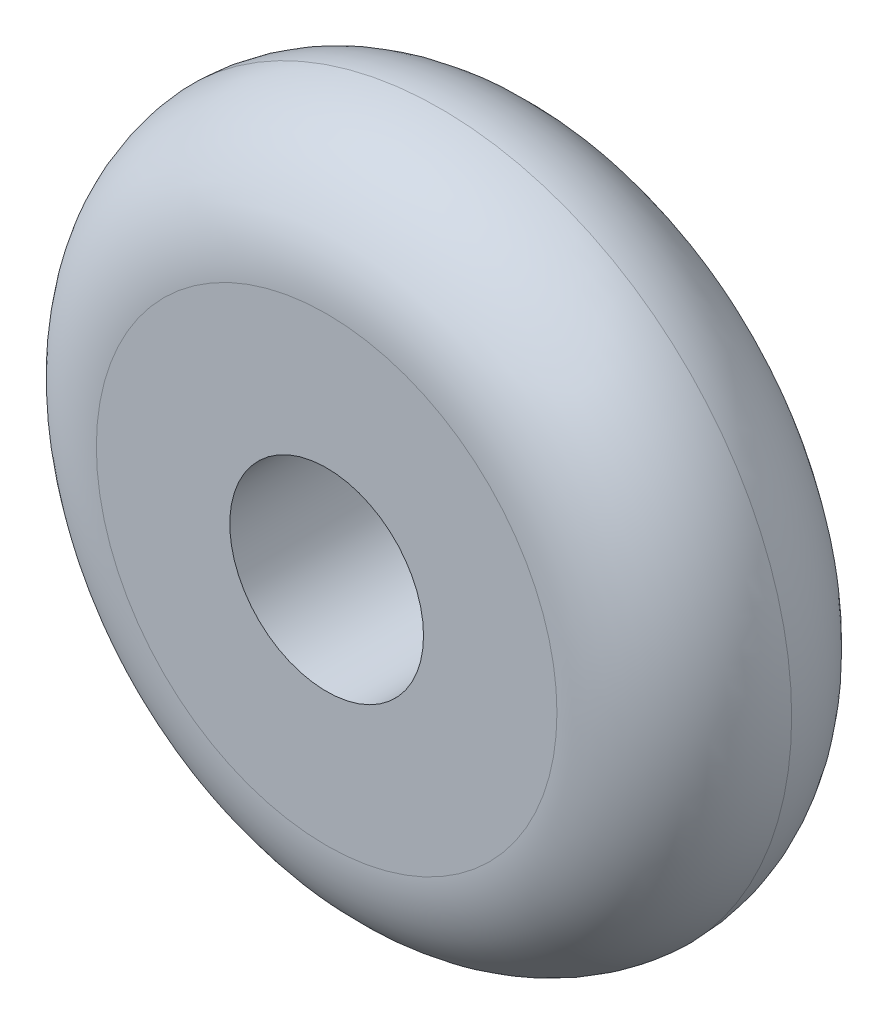
ISO-10303-21;
HEADER;
FILE_DESCRIPTION(('STEP AP214'),'2;1');
FILE_NAME('part.step','',(''),(''),'','','');
FILE_SCHEMA(('AUTOMOTIVE_DESIGN { 1 0 10303 214 1 1 1 1 }'));
ENDSEC;
DATA;
#1=APPLICATION_CONTEXT('core data for automotive mechanical design processes');
#2=APPLICATION_PROTOCOL_DEFINITION('international standard','automotive_design',2000,#1);
#3=PRODUCT_CONTEXT('',#1,'mechanical');
#4=PRODUCT('Part','Part','',(#3));
#5=PRODUCT_RELATED_PRODUCT_CATEGORY('part','',(#4));
#6=PRODUCT_DEFINITION_FORMATION('','',#4);
#7=PRODUCT_DEFINITION_CONTEXT('part definition',#1,'design');
#8=PRODUCT_DEFINITION('design','',#6,#7);
#9=PRODUCT_DEFINITION_SHAPE('','',#8);
#10=(LENGTH_UNIT() NAMED_UNIT(*) SI_UNIT(.MILLI.,.METRE.));
#11=(NAMED_UNIT(*) PLANE_ANGLE_UNIT() SI_UNIT($,.RADIAN.));
#12=(NAMED_UNIT(*) SI_UNIT($,.STERADIAN.) SOLID_ANGLE_UNIT());
#13=UNCERTAINTY_MEASURE_WITH_UNIT(LENGTH_MEASURE(1.E-05),#10,'distance_accuracy_value','');
#14=(GEOMETRIC_REPRESENTATION_CONTEXT(3) GLOBAL_UNCERTAINTY_ASSIGNED_CONTEXT((#13)) GLOBAL_UNIT_ASSIGNED_CONTEXT((#10,
#11,#12)) REPRESENTATION_CONTEXT('',''));
#15=CARTESIAN_POINT('',(0.,0.,0.));
#16=DIRECTION('',(0.,0.,1.));
#17=DIRECTION('',(1.,0.,0.));
#18=AXIS2_PLACEMENT_3D('',#15,#16,#17);
#19=CARTESIAN_POINT('',(0.,0.,9.7));
#20=DIRECTION('',(0.,0.,1.));
#21=DIRECTION('',(1.,0.,0.));
#22=AXIS2_PLACEMENT_3D('',#19,#20,#21);
#23=PLANE('',#22);
#24=CARTESIAN_POINT('',(0.,0.,9.7));
#25=DIRECTION('',(0.,0.,1.));
#26=DIRECTION('',(1.,0.,0.));
#27=AXIS2_PLACEMENT_3D('',#24,#25,#26);
#28=CIRCLE('',#27,9.50900811461289);
#29=CARTESIAN_POINT('',(9.50900811461289,0.,9.7));
#30=VERTEX_POINT('',#29);
#31=EDGE_CURVE('E11',#30,#30,#28,.T.);
#32=ORIENTED_EDGE('',*,*,#31,.T.);
#33=EDGE_LOOP('',(#32));
#34=FACE_BOUND('',#33,.T.);
#35=CARTESIAN_POINT('',(0.,0.,9.7));
#36=DIRECTION('',(0.,0.,1.));
#37=DIRECTION('',(1.,0.,0.));
#38=AXIS2_PLACEMENT_3D('',#35,#36,#37);
#39=CIRCLE('',#38,4.);
#40=CARTESIAN_POINT('',(4.,0.,9.7));
#41=VERTEX_POINT('',#40);
#42=EDGE_CURVE('E61',#41,#41,#39,.T.);
#43=ORIENTED_EDGE('',*,*,#42,.F.);
#44=EDGE_LOOP('',(#43));
#45=FACE_BOUND('',#44,.T.);
#46=ADVANCED_FACE('F43',(#34,#45),#23,.T.);
#47=CARTESIAN_POINT('',(0.,0.,0.));
#48=DIRECTION('',(0.,0.,1.));
#49=DIRECTION('',(1.,0.,0.));
#50=AXIS2_PLACEMENT_3D('',#47,#48,#49);
#51=PLANE('',#50);
#52=CARTESIAN_POINT('',(0.,0.,0.));
#53=DIRECTION('',(0.,0.,1.));
#54=DIRECTION('',(1.,0.,0.));
#55=AXIS2_PLACEMENT_3D('',#52,#53,#54);
#56=CIRCLE('',#55,9.5);
#57=CARTESIAN_POINT('',(9.5,0.,0.));
#58=VERTEX_POINT('',#57);
#59=EDGE_CURVE('E51',#58,#58,#56,.F.);
#60=ORIENTED_EDGE('',*,*,#59,.T.);
#61=EDGE_LOOP('',(#60));
#62=FACE_BOUND('',#61,.T.);
#63=CARTESIAN_POINT('',(0.,0.,0.));
#64=DIRECTION('',(0.,0.,1.));
#65=DIRECTION('',(1.,0.,0.));
#66=AXIS2_PLACEMENT_3D('',#63,#64,#65);
#67=CIRCLE('',#66,4.);
#68=CARTESIAN_POINT('',(4.,0.,0.));
#69=VERTEX_POINT('',#68);
#70=EDGE_CURVE('E64',#69,#69,#67,.T.);
#71=ORIENTED_EDGE('',*,*,#70,.T.);
#72=EDGE_LOOP('',(#71));
#73=FACE_BOUND('',#72,.T.);
#74=ADVANCED_FACE('F76',(#62,#73),#51,.F.);
#75=CARTESIAN_POINT('',(0.,0.,9.7));
#76=DIRECTION('',(0.,0.,-1.));
#77=DIRECTION('',(-1.,0.,0.));
#78=AXIS2_PLACEMENT_3D('',#75,#76,#77);
#79=CYLINDRICAL_SURFACE('',#78,4.);
#80=ORIENTED_EDGE('',*,*,#42,.T.);
#81=EDGE_LOOP('',(#80));
#82=FACE_BOUND('',#81,.T.);
#83=ORIENTED_EDGE('',*,*,#70,.F.);
#84=EDGE_LOOP('',(#83));
#85=FACE_BOUND('',#84,.T.);
#86=ADVANCED_FACE('F72',(#82,#85),#79,.F.);
#87=CARTESIAN_POINT('',(0.,0.,5.));
#88=DIRECTION('',(0.,0.,1.));
#89=DIRECTION('',(1.,0.,0.));
#90=AXIS2_PLACEMENT_3D('',#87,#88,#89);
#91=TOROIDAL_SURFACE('',#90,9.5,5.);
#92=ORIENTED_EDGE('',*,*,#59,.F.);
#93=EDGE_LOOP('',(#92));
#94=FACE_BOUND('',#93,.T.);
#95=CARTESIAN_POINT('',(0.,0.,5.));
#96=DIRECTION('',(0.,0.,1.));
#97=DIRECTION('',(1.,0.,0.));
#98=AXIS2_PLACEMENT_3D('',#95,#96,#97);
#99=CIRCLE('',#98,14.5);
#100=CARTESIAN_POINT('',(14.5,0.,5.));
#101=VERTEX_POINT('',#100);
#102=EDGE_CURVE('E56',#101,#101,#99,.T.);
#103=ORIENTED_EDGE('',*,*,#102,.F.);
#104=EDGE_LOOP('',(#103));
#105=FACE_BOUND('',#104,.T.);
#106=ADVANCED_FACE('F83',(#94,#105),#91,.T.);
#107=CARTESIAN_POINT('',(0.,0.,4.7));
#108=DIRECTION('',(0.,0.,-1.));
#109=DIRECTION('',(-1.,0.,0.));
#110=AXIS2_PLACEMENT_3D('',#107,#108,#109);
#111=TOROIDAL_SURFACE('',#110,9.50900811461289,5.);
#112=ORIENTED_EDGE('',*,*,#102,.T.);
#113=EDGE_LOOP('',(#112));
#114=FACE_BOUND('',#113,.T.);
#115=ORIENTED_EDGE('',*,*,#31,.F.);
#116=EDGE_LOOP('',(#115));
#117=FACE_BOUND('',#116,.T.);
#118=ADVANCED_FACE('F45',(#114,#117),#111,.T.);
#119=CLOSED_SHELL('',(#46,#74,#86,#106,#118));
#120=MANIFOLD_SOLID_BREP('B2',#119);
#121=ADVANCED_BREP_SHAPE_REPRESENTATION('',(#18,#120),#14);
#122=SHAPE_DEFINITION_REPRESENTATION(#9,#121);
ENDSEC;
END-ISO-10303-21;
